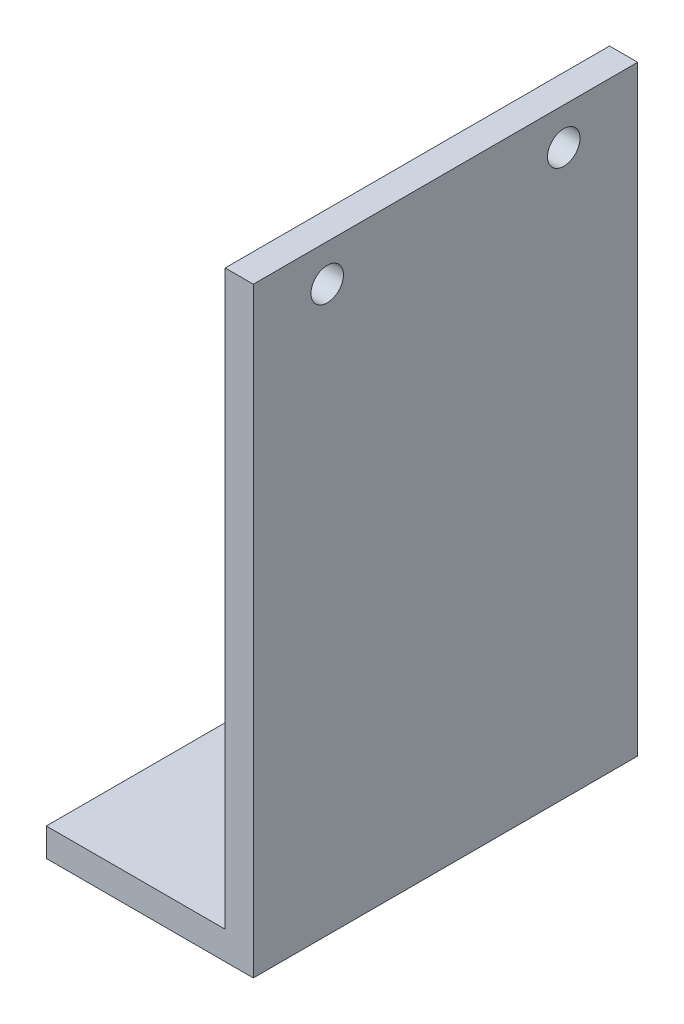
ISO-10303-21;
HEADER;
FILE_DESCRIPTION(('STEP AP214'),'2;1');
FILE_NAME('part.step','',(''),(''),'','','');
FILE_SCHEMA(('AUTOMOTIVE_DESIGN { 1 0 10303 214 1 1 1 1 }'));
ENDSEC;
DATA;
#1=APPLICATION_CONTEXT('core data for automotive mechanical design processes');
#2=APPLICATION_PROTOCOL_DEFINITION('international standard','automotive_design',2000,#1);
#3=PRODUCT_CONTEXT('',#1,'mechanical');
#4=PRODUCT('Part','Part','',(#3));
#5=PRODUCT_RELATED_PRODUCT_CATEGORY('part','',(#4));
#6=PRODUCT_DEFINITION_FORMATION('','',#4);
#7=PRODUCT_DEFINITION_CONTEXT('part definition',#1,'design');
#8=PRODUCT_DEFINITION('design','',#6,#7);
#9=PRODUCT_DEFINITION_SHAPE('','',#8);
#10=(LENGTH_UNIT() NAMED_UNIT(*) SI_UNIT(.MILLI.,.METRE.));
#11=(NAMED_UNIT(*) PLANE_ANGLE_UNIT() SI_UNIT($,.RADIAN.));
#12=(NAMED_UNIT(*) SI_UNIT($,.STERADIAN.) SOLID_ANGLE_UNIT());
#13=UNCERTAINTY_MEASURE_WITH_UNIT(LENGTH_MEASURE(1.E-05),#10,'distance_accuracy_value','');
#14=(GEOMETRIC_REPRESENTATION_CONTEXT(3) GLOBAL_UNCERTAINTY_ASSIGNED_CONTEXT((#13)) GLOBAL_UNIT_ASSIGNED_CONTEXT((#10,
#11,#12)) REPRESENTATION_CONTEXT('',''));
#15=CARTESIAN_POINT('',(0.,0.,0.));
#16=DIRECTION('',(0.,0.,1.));
#17=DIRECTION('',(1.,0.,0.));
#18=AXIS2_PLACEMENT_3D('',#15,#16,#17);
#19=CARTESIAN_POINT('',(-77.4,19.0500000000001,-65.));
#20=DIRECTION('',(-1.,0.,0.));
#21=DIRECTION('',(0.,-1.,0.));
#22=AXIS2_PLACEMENT_3D('',#19,#20,#21);
#23=PLANE('',#22);
#24=DIRECTION('',(0.,-1.,0.));
#25=VECTOR('',#24,1.);
#26=CARTESIAN_POINT('',(-77.4,19.0500000000001,0.));
#27=LINE('',#26,#25);
#28=CARTESIAN_POINT('',(-77.4,23.8125000000001,0.));
#29=VERTEX_POINT('',#28);
#30=CARTESIAN_POINT('',(-77.4,19.0500000000001,0.));
#31=VERTEX_POINT('',#30);
#32=EDGE_CURVE('E123',#29,#31,#27,.T.);
#33=ORIENTED_EDGE('',*,*,#32,.F.);
#34=DIRECTION('',(0.,0.,1.));
#35=VECTOR('',#34,1.);
#36=CARTESIAN_POINT('',(-77.4,23.8125000000001,-65.));
#37=LINE('',#36,#35);
#38=CARTESIAN_POINT('',(-77.4,23.8125000000001,-65.));
#39=VERTEX_POINT('',#38);
#40=EDGE_CURVE('E11',#39,#29,#37,.T.);
#41=ORIENTED_EDGE('',*,*,#40,.F.);
#42=DIRECTION('',(0.,-1.,0.));
#43=VECTOR('',#42,1.);
#44=CARTESIAN_POINT('',(-77.4,19.0500000000001,-65.));
#45=LINE('',#44,#43);
#46=CARTESIAN_POINT('',(-77.4,19.0500000000001,-65.));
#47=VERTEX_POINT('',#46);
#48=EDGE_CURVE('E137',#39,#47,#45,.T.);
#49=ORIENTED_EDGE('',*,*,#48,.T.);
#50=DIRECTION('',(0.,0.,1.));
#51=VECTOR('',#50,1.);
#52=CARTESIAN_POINT('',(-77.4,19.0500000000001,-65.));
#53=LINE('',#52,#51);
#54=EDGE_CURVE('E87',#47,#31,#53,.T.);
#55=ORIENTED_EDGE('',*,*,#54,.T.);
#56=EDGE_LOOP('',(#33,#41,#49,#55));
#57=FACE_BOUND('',#56,.T.);
#58=ADVANCED_FACE('F37',(#57),#23,.T.);
#59=CARTESIAN_POINT('',(-77.4,23.8125000000001,-65.));
#60=DIRECTION('',(0.,1.,0.));
#61=DIRECTION('',(0.,0.,1.));
#62=AXIS2_PLACEMENT_3D('',#59,#60,#61);
#63=PLANE('',#62);
#64=DIRECTION('',(-1.,0.,0.));
#65=VECTOR('',#64,1.);
#66=CARTESIAN_POINT('',(-77.4,23.8125000000001,0.));
#67=LINE('',#66,#65);
#68=CARTESIAN_POINT('',(-47.1625,23.8125000000001,0.));
#69=VERTEX_POINT('',#68);
#70=EDGE_CURVE('E135',#69,#29,#67,.T.);
#71=ORIENTED_EDGE('',*,*,#70,.F.);
#72=DIRECTION('',(0.,0.,1.));
#73=VECTOR('',#72,1.);
#74=CARTESIAN_POINT('',(-47.1625,23.8125000000001,-65.));
#75=LINE('',#74,#73);
#76=CARTESIAN_POINT('',(-47.1625,23.8125000000001,-65.));
#77=VERTEX_POINT('',#76);
#78=EDGE_CURVE('E46',#77,#69,#75,.T.);
#79=ORIENTED_EDGE('',*,*,#78,.F.);
#80=DIRECTION('',(-1.,0.,0.));
#81=VECTOR('',#80,1.);
#82=CARTESIAN_POINT('',(-77.4,23.8125000000001,-65.));
#83=LINE('',#82,#81);
#84=EDGE_CURVE('E113',#77,#39,#83,.T.);
#85=ORIENTED_EDGE('',*,*,#84,.T.);
#86=ORIENTED_EDGE('',*,*,#40,.T.);
#87=EDGE_LOOP('',(#71,#79,#85,#86));
#88=FACE_BOUND('',#87,.T.);
#89=ADVANCED_FACE('F161',(#88),#63,.T.);
#90=CARTESIAN_POINT('',(-47.1625,23.8125000000001,-65.));
#91=DIRECTION('',(-1.,0.,0.));
#92=DIRECTION('',(0.,0.,1.));
#93=AXIS2_PLACEMENT_3D('',#90,#91,#92);
#94=PLANE('',#93);
#95=CARTESIAN_POINT('',(-47.1625,114.417723434978,-12.5));
#96=DIRECTION('',(-1.,0.,0.));
#97=DIRECTION('',(0.,0.,1.));
#98=AXIS2_PLACEMENT_3D('',#95,#96,#97);
#99=CIRCLE('',#98,2.75);
#100=CARTESIAN_POINT('',(-47.1625,114.417723434978,-9.74999999999999));
#101=VERTEX_POINT('',#100);
#102=EDGE_CURVE('E145',#101,#101,#99,.T.);
#103=ORIENTED_EDGE('',*,*,#102,.F.);
#104=EDGE_LOOP('',(#103));
#105=FACE_BOUND('',#104,.T.);
#106=CARTESIAN_POINT('',(-47.1625,114.417723434978,-52.5));
#107=DIRECTION('',(-1.,0.,0.));
#108=DIRECTION('',(0.,0.,1.));
#109=AXIS2_PLACEMENT_3D('',#106,#107,#108);
#110=CIRCLE('',#109,2.75);
#111=CARTESIAN_POINT('',(-47.1625,114.417723434978,-49.75));
#112=VERTEX_POINT('',#111);
#113=EDGE_CURVE('E150',#112,#112,#110,.T.);
#114=ORIENTED_EDGE('',*,*,#113,.F.);
#115=EDGE_LOOP('',(#114));
#116=FACE_BOUND('',#115,.T.);
#117=DIRECTION('',(0.,-1.,0.));
#118=VECTOR('',#117,1.);
#119=CARTESIAN_POINT('',(-47.1625,23.8125000000001,0.));
#120=LINE('',#119,#118);
#121=CARTESIAN_POINT('',(-47.1625,120.65,0.));
#122=VERTEX_POINT('',#121);
#123=EDGE_CURVE('E100',#122,#69,#120,.T.);
#124=ORIENTED_EDGE('',*,*,#123,.F.);
#125=DIRECTION('',(0.,0.,1.));
#126=VECTOR('',#125,1.);
#127=CARTESIAN_POINT('',(-47.1625,120.65,-65.));
#128=LINE('',#127,#126);
#129=CARTESIAN_POINT('',(-47.1625,120.65,-65.));
#130=VERTEX_POINT('',#129);
#131=EDGE_CURVE('E95',#130,#122,#128,.T.);
#132=ORIENTED_EDGE('',*,*,#131,.F.);
#133=DIRECTION('',(0.,-1.,0.));
#134=VECTOR('',#133,1.);
#135=CARTESIAN_POINT('',(-47.1625,23.8125000000001,-65.));
#136=LINE('',#135,#134);
#137=EDGE_CURVE('E98',#130,#77,#136,.T.);
#138=ORIENTED_EDGE('',*,*,#137,.T.);
#139=ORIENTED_EDGE('',*,*,#78,.T.);
#140=EDGE_LOOP('',(#124,#132,#138,#139));
#141=FACE_BOUND('',#140,.T.);
#142=ADVANCED_FACE('F97',(#105,#116,#141),#94,.T.);
#143=CARTESIAN_POINT('',(-47.1625,120.65,-65.));
#144=DIRECTION('',(0.,1.,0.));
#145=DIRECTION('',(0.,0.,1.));
#146=AXIS2_PLACEMENT_3D('',#143,#144,#145);
#147=PLANE('',#146);
#148=DIRECTION('',(-1.,0.,0.));
#149=VECTOR('',#148,1.);
#150=CARTESIAN_POINT('',(-47.1625,120.65,0.));
#151=LINE('',#150,#149);
#152=CARTESIAN_POINT('',(-42.4,120.65,0.));
#153=VERTEX_POINT('',#152);
#154=EDGE_CURVE('E132',#153,#122,#151,.T.);
#155=ORIENTED_EDGE('',*,*,#154,.F.);
#156=DIRECTION('',(0.,0.,1.));
#157=VECTOR('',#156,1.);
#158=CARTESIAN_POINT('',(-42.4,120.65,-65.));
#159=LINE('',#158,#157);
#160=CARTESIAN_POINT('',(-42.4,120.65,-65.));
#161=VERTEX_POINT('',#160);
#162=EDGE_CURVE('E105',#161,#153,#159,.T.);
#163=ORIENTED_EDGE('',*,*,#162,.F.);
#164=DIRECTION('',(-1.,0.,0.));
#165=VECTOR('',#164,1.);
#166=CARTESIAN_POINT('',(-47.1625,120.65,-65.));
#167=LINE('',#166,#165);
#168=EDGE_CURVE('E111',#161,#130,#167,.T.);
#169=ORIENTED_EDGE('',*,*,#168,.T.);
#170=ORIENTED_EDGE('',*,*,#131,.T.);
#171=EDGE_LOOP('',(#155,#163,#169,#170));
#172=FACE_BOUND('',#171,.T.);
#173=ADVANCED_FACE('F115',(#172),#147,.T.);
#174=CARTESIAN_POINT('',(-42.4,19.0500000000001,-65.));
#175=DIRECTION('',(1.,0.,0.));
#176=DIRECTION('',(0.,0.,-1.));
#177=AXIS2_PLACEMENT_3D('',#174,#175,#176);
#178=PLANE('',#177);
#179=CARTESIAN_POINT('',(-42.4,114.417723434978,-12.5));
#180=DIRECTION('',(1.,0.,0.));
#181=DIRECTION('',(0.,0.,-1.));
#182=AXIS2_PLACEMENT_3D('',#179,#180,#181);
#183=CIRCLE('',#182,2.75);
#184=CARTESIAN_POINT('',(-42.4,114.417723434978,-15.25));
#185=VERTEX_POINT('',#184);
#186=EDGE_CURVE('E40',#185,#185,#183,.T.);
#187=ORIENTED_EDGE('',*,*,#186,.F.);
#188=EDGE_LOOP('',(#187));
#189=FACE_BOUND('',#188,.T.);
#190=CARTESIAN_POINT('',(-42.4,114.417723434978,-52.5));
#191=DIRECTION('',(1.,0.,0.));
#192=DIRECTION('',(0.,0.,-1.));
#193=AXIS2_PLACEMENT_3D('',#190,#191,#192);
#194=CIRCLE('',#193,2.75);
#195=CARTESIAN_POINT('',(-42.4,114.417723434978,-55.25));
#196=VERTEX_POINT('',#195);
#197=EDGE_CURVE('E143',#196,#196,#194,.T.);
#198=ORIENTED_EDGE('',*,*,#197,.F.);
#199=EDGE_LOOP('',(#198));
#200=FACE_BOUND('',#199,.T.);
#201=DIRECTION('',(0.,1.,0.));
#202=VECTOR('',#201,1.);
#203=CARTESIAN_POINT('',(-42.4,19.0500000000001,0.));
#204=LINE('',#203,#202);
#205=CARTESIAN_POINT('',(-42.4,19.0500000000001,0.));
#206=VERTEX_POINT('',#205);
#207=EDGE_CURVE('E129',#206,#153,#204,.T.);
#208=ORIENTED_EDGE('',*,*,#207,.F.);
#209=DIRECTION('',(0.,0.,1.));
#210=VECTOR('',#209,1.);
#211=CARTESIAN_POINT('',(-42.4,19.0500000000001,-65.));
#212=LINE('',#211,#210);
#213=CARTESIAN_POINT('',(-42.4,19.0500000000001,-65.));
#214=VERTEX_POINT('',#213);
#215=EDGE_CURVE('E141',#214,#206,#212,.T.);
#216=ORIENTED_EDGE('',*,*,#215,.F.);
#217=DIRECTION('',(0.,1.,0.));
#218=VECTOR('',#217,1.);
#219=CARTESIAN_POINT('',(-42.4,19.0500000000001,-65.));
#220=LINE('',#219,#218);
#221=EDGE_CURVE('E116',#214,#161,#220,.T.);
#222=ORIENTED_EDGE('',*,*,#221,.T.);
#223=ORIENTED_EDGE('',*,*,#162,.T.);
#224=EDGE_LOOP('',(#208,#216,#222,#223));
#225=FACE_BOUND('',#224,.T.);
#226=ADVANCED_FACE('F175',(#189,#200,#225),#178,.T.);
#227=CARTESIAN_POINT('',(-77.4,19.0500000000001,-65.));
#228=DIRECTION('',(0.,-1.,0.));
#229=DIRECTION('',(0.,0.,-1.));
#230=AXIS2_PLACEMENT_3D('',#227,#228,#229);
#231=PLANE('',#230);
#232=DIRECTION('',(1.,0.,0.));
#233=VECTOR('',#232,1.);
#234=CARTESIAN_POINT('',(-77.4,19.0500000000001,0.));
#235=LINE('',#234,#233);
#236=EDGE_CURVE('E126',#31,#206,#235,.T.);
#237=ORIENTED_EDGE('',*,*,#236,.F.);
#238=ORIENTED_EDGE('',*,*,#54,.F.);
#239=DIRECTION('',(1.,0.,0.));
#240=VECTOR('',#239,1.);
#241=CARTESIAN_POINT('',(-77.4,19.0500000000001,-65.));
#242=LINE('',#241,#240);
#243=EDGE_CURVE('E118',#47,#214,#242,.T.);
#244=ORIENTED_EDGE('',*,*,#243,.T.);
#245=ORIENTED_EDGE('',*,*,#215,.T.);
#246=EDGE_LOOP('',(#237,#238,#244,#245));
#247=FACE_BOUND('',#246,.T.);
#248=ADVANCED_FACE('F157',(#247),#231,.T.);
#249=CARTESIAN_POINT('',(0.,0.,-65.));
#250=DIRECTION('',(0.,0.,-1.));
#251=DIRECTION('',(-1.,0.,0.));
#252=AXIS2_PLACEMENT_3D('',#249,#250,#251);
#253=PLANE('',#252);
#254=ORIENTED_EDGE('',*,*,#48,.F.);
#255=ORIENTED_EDGE('',*,*,#84,.F.);
#256=ORIENTED_EDGE('',*,*,#137,.F.);
#257=ORIENTED_EDGE('',*,*,#168,.F.);
#258=ORIENTED_EDGE('',*,*,#221,.F.);
#259=ORIENTED_EDGE('',*,*,#243,.F.);
#260=EDGE_LOOP('',(#254,#255,#256,#257,#258,#259));
#261=FACE_BOUND('',#260,.T.);
#262=ADVANCED_FACE('F109',(#261),#253,.T.);
#263=CARTESIAN_POINT('',(0.,0.,0.));
#264=DIRECTION('',(0.,0.,-1.));
#265=DIRECTION('',(-1.,0.,0.));
#266=AXIS2_PLACEMENT_3D('',#263,#264,#265);
#267=PLANE('',#266);
#268=ORIENTED_EDGE('',*,*,#32,.T.);
#269=ORIENTED_EDGE('',*,*,#236,.T.);
#270=ORIENTED_EDGE('',*,*,#207,.T.);
#271=ORIENTED_EDGE('',*,*,#154,.T.);
#272=ORIENTED_EDGE('',*,*,#123,.T.);
#273=ORIENTED_EDGE('',*,*,#70,.T.);
#274=EDGE_LOOP('',(#268,#269,#270,#271,#272,#273));
#275=FACE_BOUND('',#274,.T.);
#276=ADVANCED_FACE('F160',(#275),#267,.F.);
#277=CARTESIAN_POINT('',(-37.1625,114.417723434978,-52.5));
#278=DIRECTION('',(-1.,0.,0.));
#279=DIRECTION('',(0.,0.,1.));
#280=AXIS2_PLACEMENT_3D('',#277,#278,#279);
#281=CYLINDRICAL_SURFACE('',#280,2.75);
#282=ORIENTED_EDGE('',*,*,#197,.T.);
#283=EDGE_LOOP('',(#282));
#284=FACE_BOUND('',#283,.T.);
#285=ORIENTED_EDGE('',*,*,#113,.T.);
#286=EDGE_LOOP('',(#285));
#287=FACE_BOUND('',#286,.T.);
#288=ADVANCED_FACE('F185',(#284,#287),#281,.F.);
#289=CARTESIAN_POINT('',(-37.1625,114.417723434978,-12.5));
#290=DIRECTION('',(-1.,0.,0.));
#291=DIRECTION('',(0.,0.,1.));
#292=AXIS2_PLACEMENT_3D('',#289,#290,#291);
#293=CYLINDRICAL_SURFACE('',#292,2.75);
#294=ORIENTED_EDGE('',*,*,#186,.T.);
#295=EDGE_LOOP('',(#294));
#296=FACE_BOUND('',#295,.T.);
#297=ORIENTED_EDGE('',*,*,#102,.T.);
#298=EDGE_LOOP('',(#297));
#299=FACE_BOUND('',#298,.T.);
#300=ADVANCED_FACE('F189',(#296,#299),#293,.F.);
#301=CLOSED_SHELL('',(#58,#89,#142,#173,#226,#248,#262,#276,#288,#300));
#302=MANIFOLD_SOLID_BREP('B2',#301);
#303=ADVANCED_BREP_SHAPE_REPRESENTATION('',(#18,#302),#14);
#304=SHAPE_DEFINITION_REPRESENTATION(#9,#303);
ENDSEC;
END-ISO-10303-21;
